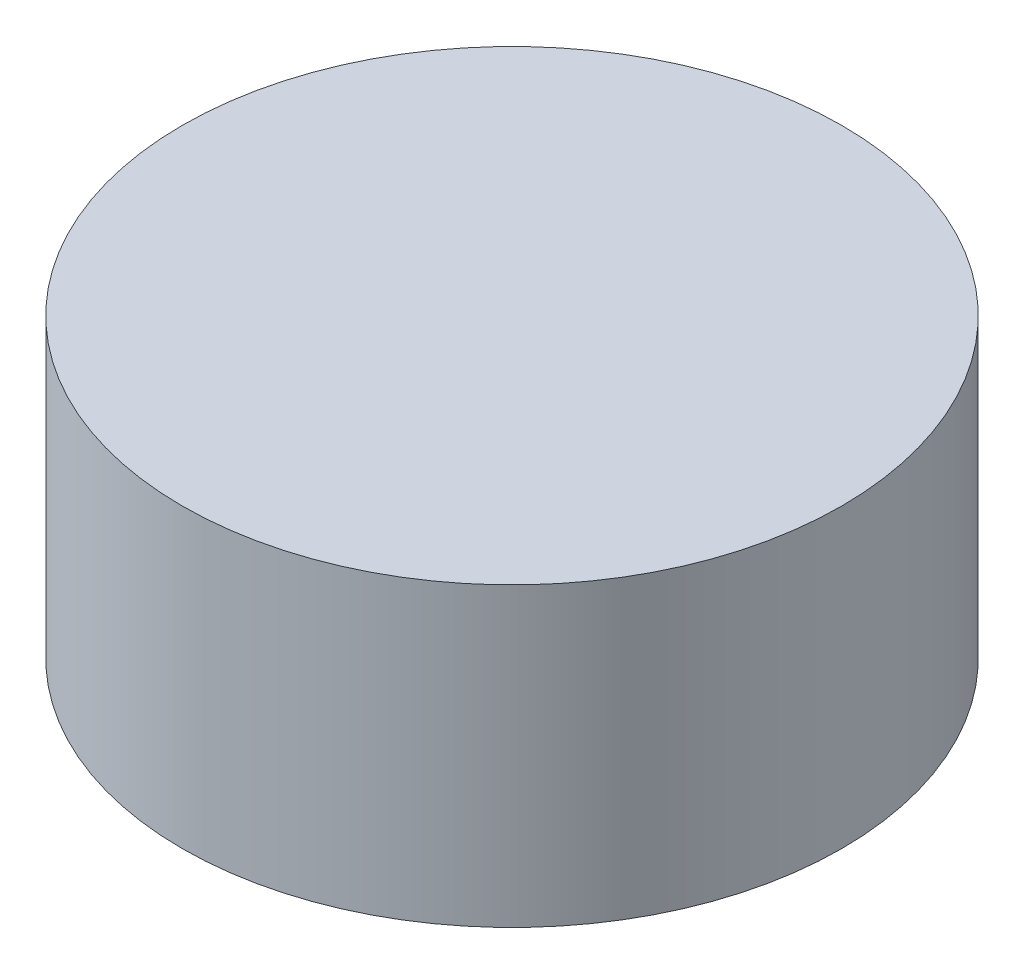
ISO-10303-21;
HEADER;
FILE_DESCRIPTION(('STEP AP214'),'2;1');
FILE_NAME('part.step','',(''),(''),'','','');
FILE_SCHEMA(('AUTOMOTIVE_DESIGN { 1 0 10303 214 1 1 1 1 }'));
ENDSEC;
DATA;
#1=APPLICATION_CONTEXT('core data for automotive mechanical design processes');
#2=APPLICATION_PROTOCOL_DEFINITION('international standard','automotive_design',2000,#1);
#3=PRODUCT_CONTEXT('',#1,'mechanical');
#4=PRODUCT('Part','Part','',(#3));
#5=PRODUCT_RELATED_PRODUCT_CATEGORY('part','',(#4));
#6=PRODUCT_DEFINITION_FORMATION('','',#4);
#7=PRODUCT_DEFINITION_CONTEXT('part definition',#1,'design');
#8=PRODUCT_DEFINITION('design','',#6,#7);
#9=PRODUCT_DEFINITION_SHAPE('','',#8);
#10=(LENGTH_UNIT() NAMED_UNIT(*) SI_UNIT(.MILLI.,.METRE.));
#11=(NAMED_UNIT(*) PLANE_ANGLE_UNIT() SI_UNIT($,.RADIAN.));
#12=(NAMED_UNIT(*) SI_UNIT($,.STERADIAN.) SOLID_ANGLE_UNIT());
#13=UNCERTAINTY_MEASURE_WITH_UNIT(LENGTH_MEASURE(1.E-05),#10,'distance_accuracy_value','');
#14=(GEOMETRIC_REPRESENTATION_CONTEXT(3) GLOBAL_UNCERTAINTY_ASSIGNED_CONTEXT((#13)) GLOBAL_UNIT_ASSIGNED_CONTEXT((#10,
#11,#12)) REPRESENTATION_CONTEXT('',''));
#15=CARTESIAN_POINT('',(0.,0.,0.));
#16=DIRECTION('',(0.,0.,1.));
#17=DIRECTION('',(1.,0.,0.));
#18=AXIS2_PLACEMENT_3D('',#15,#16,#17);
#19=CARTESIAN_POINT('',(0.,18.,0.));
#20=DIRECTION('',(0.,-1.,0.));
#21=DIRECTION('',(0.,0.,-1.));
#22=AXIS2_PLACEMENT_3D('',#19,#20,#21);
#23=CYLINDRICAL_SURFACE('',#22,20.);
#24=CARTESIAN_POINT('',(0.,18.,0.));
#25=DIRECTION('',(0.,1.,0.));
#26=DIRECTION('',(0.,0.,1.));
#27=AXIS2_PLACEMENT_3D('',#24,#25,#26);
#28=CIRCLE('',#27,20.);
#29=CARTESIAN_POINT('',(0.,18.,20.));
#30=VERTEX_POINT('',#29);
#31=EDGE_CURVE('E10',#30,#30,#28,.T.);
#32=ORIENTED_EDGE('',*,*,#31,.F.);
#33=EDGE_LOOP('',(#32));
#34=FACE_BOUND('',#33,.T.);
#35=CARTESIAN_POINT('',(0.,0.,0.));
#36=DIRECTION('',(0.,1.,0.));
#37=DIRECTION('',(0.,0.,1.));
#38=AXIS2_PLACEMENT_3D('',#35,#36,#37);
#39=CIRCLE('',#38,20.);
#40=CARTESIAN_POINT('',(0.,0.,20.));
#41=VERTEX_POINT('',#40);
#42=EDGE_CURVE('E40',#41,#41,#39,.T.);
#43=ORIENTED_EDGE('',*,*,#42,.T.);
#44=EDGE_LOOP('',(#43));
#45=FACE_BOUND('',#44,.T.);
#46=ADVANCED_FACE('F37',(#34,#45),#23,.T.);
#47=CARTESIAN_POINT('',(0.,18.,0.));
#48=DIRECTION('',(0.,1.,0.));
#49=DIRECTION('',(0.,0.,1.));
#50=AXIS2_PLACEMENT_3D('',#47,#48,#49);
#51=PLANE('',#50);
#52=ORIENTED_EDGE('',*,*,#31,.T.);
#53=EDGE_LOOP('',(#52));
#54=FACE_BOUND('',#53,.T.);
#55=ADVANCED_FACE('F52',(#54),#51,.T.);
#56=CARTESIAN_POINT('',(0.,0.,0.));
#57=DIRECTION('',(0.,1.,0.));
#58=DIRECTION('',(0.,0.,1.));
#59=AXIS2_PLACEMENT_3D('',#56,#57,#58);
#60=PLANE('',#59);
#61=ORIENTED_EDGE('',*,*,#42,.F.);
#62=EDGE_LOOP('',(#61));
#63=FACE_BOUND('',#62,.T.);
#64=ADVANCED_FACE('F50',(#63),#60,.F.);
#65=CLOSED_SHELL('',(#46,#55,#64));
#66=MANIFOLD_SOLID_BREP('B2',#65);
#67=ADVANCED_BREP_SHAPE_REPRESENTATION('',(#18,#66),#14);
#68=SHAPE_DEFINITION_REPRESENTATION(#9,#67);
ENDSEC;
END-ISO-10303-21;
